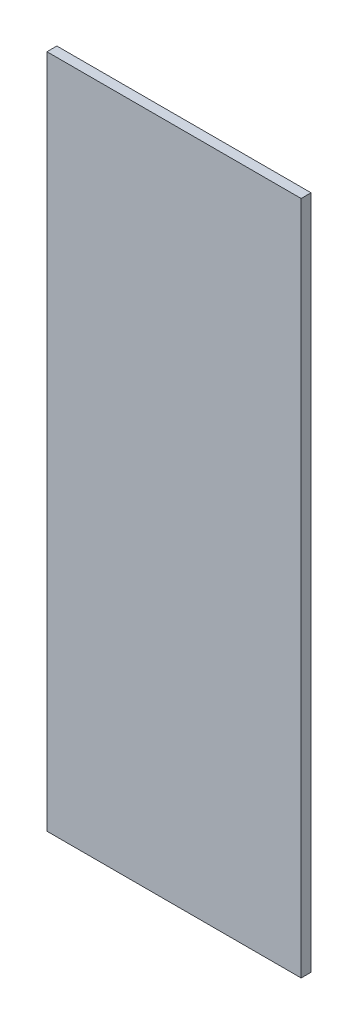
ISO-10303-21;
HEADER;
FILE_DESCRIPTION(('STEP AP214'),'2;1');
FILE_NAME('part.step','',(''),(''),'','','');
FILE_SCHEMA(('AUTOMOTIVE_DESIGN { 1 0 10303 214 1 1 1 1 }'));
ENDSEC;
DATA;
#1=APPLICATION_CONTEXT('core data for automotive mechanical design processes');
#2=APPLICATION_PROTOCOL_DEFINITION('international standard','automotive_design',2000,#1);
#3=PRODUCT_CONTEXT('',#1,'mechanical');
#4=PRODUCT('Part','Part','',(#3));
#5=PRODUCT_RELATED_PRODUCT_CATEGORY('part','',(#4));
#6=PRODUCT_DEFINITION_FORMATION('','',#4);
#7=PRODUCT_DEFINITION_CONTEXT('part definition',#1,'design');
#8=PRODUCT_DEFINITION('design','',#6,#7);
#9=PRODUCT_DEFINITION_SHAPE('','',#8);
#10=(LENGTH_UNIT() NAMED_UNIT(*) SI_UNIT(.MILLI.,.METRE.));
#11=(NAMED_UNIT(*) PLANE_ANGLE_UNIT() SI_UNIT($,.RADIAN.));
#12=(NAMED_UNIT(*) SI_UNIT($,.STERADIAN.) SOLID_ANGLE_UNIT());
#13=UNCERTAINTY_MEASURE_WITH_UNIT(LENGTH_MEASURE(1.E-05),#10,'distance_accuracy_value','');
#14=(GEOMETRIC_REPRESENTATION_CONTEXT(3) GLOBAL_UNCERTAINTY_ASSIGNED_CONTEXT((#13)) GLOBAL_UNIT_ASSIGNED_CONTEXT((#10,
#11,#12)) REPRESENTATION_CONTEXT('',''));
#15=CARTESIAN_POINT('',(0.,0.,0.));
#16=DIRECTION('',(0.,0.,1.));
#17=DIRECTION('',(1.,0.,0.));
#18=AXIS2_PLACEMENT_3D('',#15,#16,#17);
#19=CARTESIAN_POINT('',(-26.9543430602269,27.7940422209816,2.));
#20=DIRECTION('',(1.,0.,0.));
#21=DIRECTION('',(0.,1.,0.));
#22=AXIS2_PLACEMENT_3D('',#19,#20,#21);
#23=PLANE('',#22);
#24=DIRECTION('',(0.,-1.,0.));
#25=VECTOR('',#24,1.);
#26=CARTESIAN_POINT('',(-26.9543430602269,27.7940422209816,0.));
#27=LINE('',#26,#25);
#28=CARTESIAN_POINT('',(-26.9543430602269,27.7940422209816,0.));
#29=VERTEX_POINT('',#28);
#30=CARTESIAN_POINT('',(-26.9543430602268,-108.535957779018,0.));
#31=VERTEX_POINT('',#30);
#32=EDGE_CURVE('E97',#29,#31,#27,.T.);
#33=ORIENTED_EDGE('',*,*,#32,.T.);
#34=DIRECTION('',(0.,0.,-1.));
#35=VECTOR('',#34,1.);
#36=CARTESIAN_POINT('',(-26.9543430602268,-108.535957779018,2.));
#37=LINE('',#36,#35);
#38=CARTESIAN_POINT('',(-26.9543430602268,-108.535957779018,2.));
#39=VERTEX_POINT('',#38);
#40=EDGE_CURVE('E11',#39,#31,#37,.T.);
#41=ORIENTED_EDGE('',*,*,#40,.F.);
#42=DIRECTION('',(0.,-1.,0.));
#43=VECTOR('',#42,1.);
#44=CARTESIAN_POINT('',(-26.9543430602269,27.7940422209816,2.));
#45=LINE('',#44,#43);
#46=CARTESIAN_POINT('',(-26.9543430602269,27.7940422209816,2.));
#47=VERTEX_POINT('',#46);
#48=EDGE_CURVE('E85',#47,#39,#45,.T.);
#49=ORIENTED_EDGE('',*,*,#48,.F.);
#50=DIRECTION('',(0.,0.,-1.));
#51=VECTOR('',#50,1.);
#52=CARTESIAN_POINT('',(-26.9543430602269,27.7940422209816,2.));
#53=LINE('',#52,#51);
#54=EDGE_CURVE('E93',#47,#29,#53,.T.);
#55=ORIENTED_EDGE('',*,*,#54,.T.);
#56=EDGE_LOOP('',(#33,#41,#49,#55));
#57=FACE_BOUND('',#56,.T.);
#58=ADVANCED_FACE('F34',(#57),#23,.F.);
#59=CARTESIAN_POINT('',(-26.9543430602268,-108.535957779018,2.));
#60=DIRECTION('',(0.,1.,0.));
#61=DIRECTION('',(0.,0.,1.));
#62=AXIS2_PLACEMENT_3D('',#59,#60,#61);
#63=PLANE('',#62);
#64=DIRECTION('',(1.,0.,0.));
#65=VECTOR('',#64,1.);
#66=CARTESIAN_POINT('',(-26.9543430602268,-108.535957779018,0.));
#67=LINE('',#66,#65);
#68=CARTESIAN_POINT('',(24.3780552567437,-108.535957779018,0.));
#69=VERTEX_POINT('',#68);
#70=EDGE_CURVE('E89',#31,#69,#67,.T.);
#71=ORIENTED_EDGE('',*,*,#70,.T.);
#72=DIRECTION('',(0.,0.,-1.));
#73=VECTOR('',#72,1.);
#74=CARTESIAN_POINT('',(24.3780552567437,-108.535957779018,2.));
#75=LINE('',#74,#73);
#76=CARTESIAN_POINT('',(24.3780552567437,-108.535957779018,2.));
#77=VERTEX_POINT('',#76);
#78=EDGE_CURVE('E42',#77,#69,#75,.T.);
#79=ORIENTED_EDGE('',*,*,#78,.F.);
#80=DIRECTION('',(1.,0.,0.));
#81=VECTOR('',#80,1.);
#82=CARTESIAN_POINT('',(-26.9543430602268,-108.535957779018,2.));
#83=LINE('',#82,#81);
#84=EDGE_CURVE('E80',#39,#77,#83,.T.);
#85=ORIENTED_EDGE('',*,*,#84,.F.);
#86=ORIENTED_EDGE('',*,*,#40,.T.);
#87=EDGE_LOOP('',(#71,#79,#85,#86));
#88=FACE_BOUND('',#87,.T.);
#89=ADVANCED_FACE('F88',(#88),#63,.F.);
#90=CARTESIAN_POINT('',(24.3780552567437,27.7940422209816,2.));
#91=DIRECTION('',(-1.,0.,0.));
#92=DIRECTION('',(0.,-1.,0.));
#93=AXIS2_PLACEMENT_3D('',#90,#91,#92);
#94=PLANE('',#93);
#95=DIRECTION('',(0.,1.,0.));
#96=VECTOR('',#95,1.);
#97=CARTESIAN_POINT('',(24.3780552567437,27.7940422209816,0.));
#98=LINE('',#97,#96);
#99=CARTESIAN_POINT('',(24.3780552567437,27.7940422209816,0.));
#100=VERTEX_POINT('',#99);
#101=EDGE_CURVE('E67',#69,#100,#98,.T.);
#102=ORIENTED_EDGE('',*,*,#101,.T.);
#103=DIRECTION('',(0.,0.,-1.));
#104=VECTOR('',#103,1.);
#105=CARTESIAN_POINT('',(24.3780552567437,27.7940422209816,2.));
#106=LINE('',#105,#104);
#107=CARTESIAN_POINT('',(24.3780552567437,27.7940422209816,2.));
#108=VERTEX_POINT('',#107);
#109=EDGE_CURVE('E90',#108,#100,#106,.T.);
#110=ORIENTED_EDGE('',*,*,#109,.F.);
#111=DIRECTION('',(0.,1.,0.));
#112=VECTOR('',#111,1.);
#113=CARTESIAN_POINT('',(24.3780552567437,27.7940422209816,2.));
#114=LINE('',#113,#112);
#115=EDGE_CURVE('E83',#77,#108,#114,.T.);
#116=ORIENTED_EDGE('',*,*,#115,.F.);
#117=ORIENTED_EDGE('',*,*,#78,.T.);
#118=EDGE_LOOP('',(#102,#110,#116,#117));
#119=FACE_BOUND('',#118,.T.);
#120=ADVANCED_FACE('F91',(#119),#94,.F.);
#121=CARTESIAN_POINT('',(-26.9543430602269,27.7940422209816,2.));
#122=DIRECTION('',(0.,-1.,0.));
#123=DIRECTION('',(0.,0.,-1.));
#124=AXIS2_PLACEMENT_3D('',#121,#122,#123);
#125=PLANE('',#124);
#126=DIRECTION('',(-1.,0.,0.));
#127=VECTOR('',#126,1.);
#128=CARTESIAN_POINT('',(-26.9543430602269,27.7940422209816,0.));
#129=LINE('',#128,#127);
#130=EDGE_CURVE('E73',#100,#29,#129,.T.);
#131=ORIENTED_EDGE('',*,*,#130,.T.);
#132=ORIENTED_EDGE('',*,*,#54,.F.);
#133=DIRECTION('',(-1.,0.,0.));
#134=VECTOR('',#133,1.);
#135=CARTESIAN_POINT('',(-26.9543430602269,27.7940422209816,2.));
#136=LINE('',#135,#134);
#137=EDGE_CURVE('E50',#108,#47,#136,.T.);
#138=ORIENTED_EDGE('',*,*,#137,.F.);
#139=ORIENTED_EDGE('',*,*,#109,.T.);
#140=EDGE_LOOP('',(#131,#132,#138,#139));
#141=FACE_BOUND('',#140,.T.);
#142=ADVANCED_FACE('F104',(#141),#125,.F.);
#143=CARTESIAN_POINT('',(0.,0.,2.));
#144=DIRECTION('',(0.,0.,1.));
#145=DIRECTION('',(1.,0.,0.));
#146=AXIS2_PLACEMENT_3D('',#143,#144,#145);
#147=PLANE('',#146);
#148=ORIENTED_EDGE('',*,*,#48,.T.);
#149=ORIENTED_EDGE('',*,*,#84,.T.);
#150=ORIENTED_EDGE('',*,*,#115,.T.);
#151=ORIENTED_EDGE('',*,*,#137,.T.);
#152=EDGE_LOOP('',(#148,#149,#150,#151));
#153=FACE_BOUND('',#152,.T.);
#154=ADVANCED_FACE('F81',(#153),#147,.T.);
#155=CARTESIAN_POINT('',(0.,0.,0.));
#156=DIRECTION('',(0.,0.,1.));
#157=DIRECTION('',(1.,0.,0.));
#158=AXIS2_PLACEMENT_3D('',#155,#156,#157);
#159=PLANE('',#158);
#160=ORIENTED_EDGE('',*,*,#32,.F.);
#161=ORIENTED_EDGE('',*,*,#130,.F.);
#162=ORIENTED_EDGE('',*,*,#101,.F.);
#163=ORIENTED_EDGE('',*,*,#70,.F.);
#164=EDGE_LOOP('',(#160,#161,#162,#163));
#165=FACE_BOUND('',#164,.T.);
#166=ADVANCED_FACE('F107',(#165),#159,.F.);
#167=CLOSED_SHELL('',(#58,#89,#120,#142,#154,#166));
#168=MANIFOLD_SOLID_BREP('B2',#167);
#169=ADVANCED_BREP_SHAPE_REPRESENTATION('',(#18,#168),#14);
#170=SHAPE_DEFINITION_REPRESENTATION(#9,#169);
ENDSEC;
END-ISO-10303-21;
